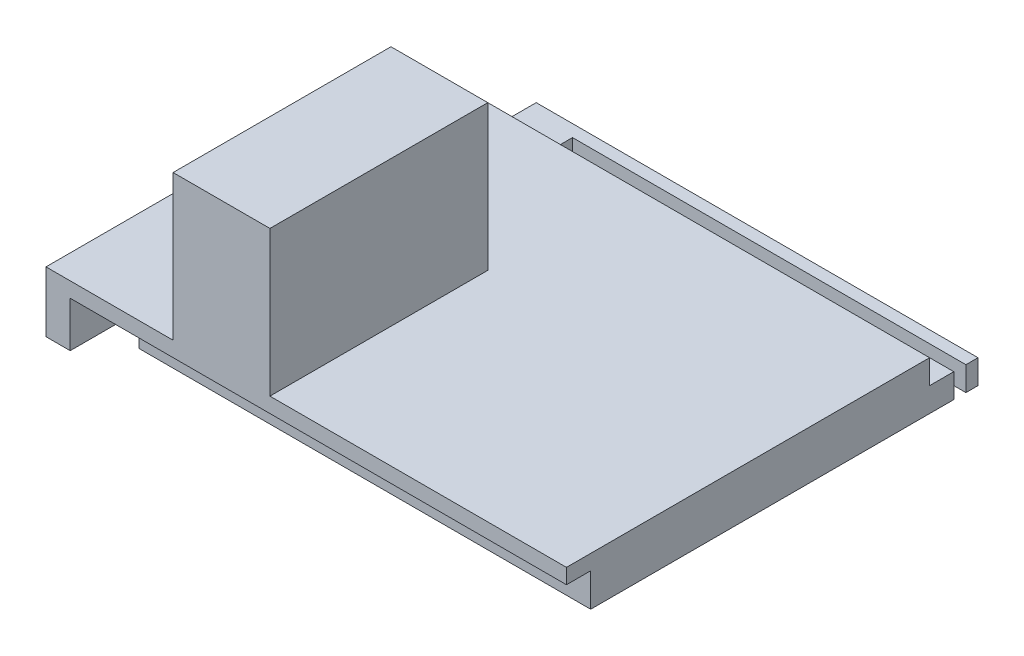
ISO-10303-21;
HEADER;
FILE_DESCRIPTION(('STEP AP214'),'2;1');
FILE_NAME('part.step','',(''),(''),'','','');
FILE_SCHEMA(('AUTOMOTIVE_DESIGN { 1 0 10303 214 1 1 1 1 }'));
ENDSEC;
DATA;
#1=APPLICATION_CONTEXT('core data for automotive mechanical design processes');
#2=APPLICATION_PROTOCOL_DEFINITION('international standard','automotive_design',2000,#1);
#3=PRODUCT_CONTEXT('',#1,'mechanical');
#4=PRODUCT('Part','Part','',(#3));
#5=PRODUCT_RELATED_PRODUCT_CATEGORY('part','',(#4));
#6=PRODUCT_DEFINITION_FORMATION('','',#4);
#7=PRODUCT_DEFINITION_CONTEXT('part definition',#1,'design');
#8=PRODUCT_DEFINITION('design','',#6,#7);
#9=PRODUCT_DEFINITION_SHAPE('','',#8);
#10=(LENGTH_UNIT() NAMED_UNIT(*) SI_UNIT(.MILLI.,.METRE.));
#11=(NAMED_UNIT(*) PLANE_ANGLE_UNIT() SI_UNIT($,.RADIAN.));
#12=(NAMED_UNIT(*) SI_UNIT($,.STERADIAN.) SOLID_ANGLE_UNIT());
#13=UNCERTAINTY_MEASURE_WITH_UNIT(LENGTH_MEASURE(1.E-05),#10,'distance_accuracy_value','');
#14=(GEOMETRIC_REPRESENTATION_CONTEXT(3) GLOBAL_UNCERTAINTY_ASSIGNED_CONTEXT((#13)) GLOBAL_UNIT_ASSIGNED_CONTEXT((#10,
#11,#12)) REPRESENTATION_CONTEXT('',''));
#15=CARTESIAN_POINT('',(0.,0.,0.));
#16=DIRECTION('',(0.,0.,1.));
#17=DIRECTION('',(1.,0.,0.));
#18=AXIS2_PLACEMENT_3D('',#15,#16,#17);
#19=CARTESIAN_POINT('',(0.,0.,18.));
#20=DIRECTION('',(0.,0.,1.));
#21=DIRECTION('',(1.,0.,0.));
#22=AXIS2_PLACEMENT_3D('',#19,#20,#21);
#23=PLANE('',#22);
#24=DIRECTION('',(1.,0.,0.));
#25=VECTOR('',#24,1.);
#26=CARTESIAN_POINT('',(-33.1377795178358,2.75505050617718,18.));
#27=LINE('',#26,#25);
#28=CARTESIAN_POINT('',(-31.,2.75505050617718,18.));
#29=VERTEX_POINT('',#28);
#30=CARTESIAN_POINT('',(10.,2.75505050617718,18.));
#31=VERTEX_POINT('',#30);
#32=EDGE_CURVE('E418',#29,#31,#27,.T.);
#33=ORIENTED_EDGE('',*,*,#32,.T.);
#34=DIRECTION('',(0.,-1.,0.));
#35=VECTOR('',#34,1.);
#36=CARTESIAN_POINT('',(10.,0.,18.));
#37=LINE('',#36,#35);
#38=CARTESIAN_POINT('',(10.,4.,18.));
#39=VERTEX_POINT('',#38);
#40=EDGE_CURVE('E396',#39,#31,#37,.T.);
#41=ORIENTED_EDGE('',*,*,#40,.F.);
#42=DIRECTION('',(-1.,0.,0.));
#43=VECTOR('',#42,1.);
#44=CARTESIAN_POINT('',(-24.5,4.,18.));
#45=LINE('',#44,#43);
#46=CARTESIAN_POINT('',(-14.5,4.,18.));
#47=VERTEX_POINT('',#46);
#48=EDGE_CURVE('E230',#39,#47,#45,.T.);
#49=ORIENTED_EDGE('',*,*,#48,.T.);
#50=DIRECTION('',(0.,-1.,0.));
#51=VECTOR('',#50,1.);
#52=CARTESIAN_POINT('',(-14.5,0.,18.));
#53=LINE('',#52,#51);
#54=CARTESIAN_POINT('',(-14.5,16.,18.));
#55=VERTEX_POINT('',#54);
#56=EDGE_CURVE('E221',#55,#47,#53,.T.);
#57=ORIENTED_EDGE('',*,*,#56,.F.);
#58=DIRECTION('',(1.,0.,0.));
#59=VECTOR('',#58,1.);
#60=CARTESIAN_POINT('',(0.,16.,18.));
#61=LINE('',#60,#59);
#62=CARTESIAN_POINT('',(-22.5,16.,18.));
#63=VERTEX_POINT('',#62);
#64=EDGE_CURVE('E219',#63,#55,#61,.T.);
#65=ORIENTED_EDGE('',*,*,#64,.F.);
#66=DIRECTION('',(0.,1.,0.));
#67=VECTOR('',#66,1.);
#68=CARTESIAN_POINT('',(-22.5,0.,18.));
#69=LINE('',#68,#67);
#70=CARTESIAN_POINT('',(-22.5,4.,18.));
#71=VERTEX_POINT('',#70);
#72=EDGE_CURVE('E203',#71,#63,#69,.T.);
#73=ORIENTED_EDGE('',*,*,#72,.F.);
#74=CARTESIAN_POINT('',(-33.,4.,18.));
#75=VERTEX_POINT('',#74);
#76=EDGE_CURVE('E215',#71,#75,#45,.T.);
#77=ORIENTED_EDGE('',*,*,#76,.T.);
#78=DIRECTION('',(0.,-1.,0.));
#79=VECTOR('',#78,1.);
#80=CARTESIAN_POINT('',(-33.,4.,18.));
#81=LINE('',#80,#79);
#82=CARTESIAN_POINT('',(-33.,-1.,18.));
#83=VERTEX_POINT('',#82);
#84=EDGE_CURVE('E237',#75,#83,#81,.T.);
#85=ORIENTED_EDGE('',*,*,#84,.T.);
#86=DIRECTION('',(1.,0.,0.));
#87=VECTOR('',#86,1.);
#88=CARTESIAN_POINT('',(-33.,-1.,18.));
#89=LINE('',#88,#87);
#90=CARTESIAN_POINT('',(-31.,-1.,18.));
#91=VERTEX_POINT('',#90);
#92=EDGE_CURVE('E246',#83,#91,#89,.T.);
#93=ORIENTED_EDGE('',*,*,#92,.T.);
#94=DIRECTION('',(0.,1.,0.));
#95=VECTOR('',#94,1.);
#96=CARTESIAN_POINT('',(-31.,-1.,18.));
#97=LINE('',#96,#95);
#98=EDGE_CURVE('E250',#91,#29,#97,.T.);
#99=ORIENTED_EDGE('',*,*,#98,.T.);
#100=EDGE_LOOP('',(#33,#41,#49,#57,#65,#73,#77,#85,#93,#99));
#101=FACE_BOUND('',#100,.T.);
#102=ADVANCED_FACE('F51',(#101),#23,.T.);
#103=CARTESIAN_POINT('',(0.,2.,0.));
#104=DIRECTION('',(0.,1.,0.));
#105=DIRECTION('',(0.,0.,1.));
#106=AXIS2_PLACEMENT_3D('',#103,#104,#105);
#107=PLANE('',#106);
#108=DIRECTION('',(1.,0.,0.));
#109=VECTOR('',#108,1.);
#110=CARTESIAN_POINT('',(-31.,2.,-12.));
#111=LINE('',#110,#109);
#112=CARTESIAN_POINT('',(-26.5,2.,-12.));
#113=VERTEX_POINT('',#112);
#114=CARTESIAN_POINT('',(10.,2.,-12.));
#115=VERTEX_POINT('',#114);
#116=EDGE_CURVE('E253',#113,#115,#111,.T.);
#117=ORIENTED_EDGE('',*,*,#116,.T.);
#118=DIRECTION('',(0.,0.,1.));
#119=VECTOR('',#118,1.);
#120=CARTESIAN_POINT('',(10.,2.,0.));
#121=LINE('',#120,#119);
#122=CARTESIAN_POINT('',(10.,2.,-14.));
#123=VERTEX_POINT('',#122);
#124=EDGE_CURVE('E407',#123,#115,#121,.T.);
#125=ORIENTED_EDGE('',*,*,#124,.F.);
#126=DIRECTION('',(1.,0.,0.));
#127=VECTOR('',#126,1.);
#128=CARTESIAN_POINT('',(0.,2.,-14.));
#129=LINE('',#128,#127);
#130=CARTESIAN_POINT('',(-22.5,2.,-14.));
#131=VERTEX_POINT('',#130);
#132=EDGE_CURVE('E295',#131,#123,#129,.T.);
#133=ORIENTED_EDGE('',*,*,#132,.F.);
#134=DIRECTION('',(0.,0.,1.));
#135=VECTOR('',#134,1.);
#136=CARTESIAN_POINT('',(-22.5,2.,0.));
#137=LINE('',#136,#135);
#138=CARTESIAN_POINT('',(-22.5,2.,-15.));
#139=VERTEX_POINT('',#138);
#140=EDGE_CURVE('E304',#139,#131,#137,.T.);
#141=ORIENTED_EDGE('',*,*,#140,.F.);
#142=DIRECTION('',(1.,0.,0.));
#143=VECTOR('',#142,1.);
#144=CARTESIAN_POINT('',(0.,2.,-15.));
#145=LINE('',#144,#143);
#146=CARTESIAN_POINT('',(10.,2.,-15.));
#147=VERTEX_POINT('',#146);
#148=EDGE_CURVE('E299',#139,#147,#145,.T.);
#149=ORIENTED_EDGE('',*,*,#148,.T.);
#150=CARTESIAN_POINT('',(10.,2.,-16.));
#151=VERTEX_POINT('',#150);
#152=EDGE_CURVE('E399',#151,#147,#121,.T.);
#153=ORIENTED_EDGE('',*,*,#152,.F.);
#154=DIRECTION('',(-1.,0.,0.));
#155=VECTOR('',#154,1.);
#156=CARTESIAN_POINT('',(0.,2.,-16.));
#157=LINE('',#156,#155);
#158=CARTESIAN_POINT('',(-26.5,2.,-16.));
#159=VERTEX_POINT('',#158);
#160=EDGE_CURVE('E344',#151,#159,#157,.T.);
#161=ORIENTED_EDGE('',*,*,#160,.T.);
#162=DIRECTION('',(0.,0.,1.));
#163=VECTOR('',#162,1.);
#164=CARTESIAN_POINT('',(-26.5,2.,0.));
#165=LINE('',#164,#163);
#166=EDGE_CURVE('E347',#159,#113,#165,.T.);
#167=ORIENTED_EDGE('',*,*,#166,.T.);
#168=EDGE_LOOP('',(#117,#125,#133,#141,#149,#153,#161,#167));
#169=FACE_BOUND('',#168,.T.);
#170=ADVANCED_FACE('F438',(#169),#107,.T.);
#171=CARTESIAN_POINT('',(0.,0.,0.));
#172=DIRECTION('',(0.,1.,0.));
#173=DIRECTION('',(0.,0.,1.));
#174=AXIS2_PLACEMENT_3D('',#171,#172,#173);
#175=PLANE('',#174);
#176=DIRECTION('',(0.,0.,1.));
#177=VECTOR('',#176,1.);
#178=CARTESIAN_POINT('',(10.,0.,0.));
#179=LINE('',#178,#177);
#180=CARTESIAN_POINT('',(10.,0.,-14.));
#181=VERTEX_POINT('',#180);
#182=CARTESIAN_POINT('',(10.,0.,16.));
#183=VERTEX_POINT('',#182);
#184=EDGE_CURVE('E382',#181,#183,#179,.T.);
#185=ORIENTED_EDGE('',*,*,#184,.T.);
#186=DIRECTION('',(-1.,0.,0.));
#187=VECTOR('',#186,1.);
#188=CARTESIAN_POINT('',(-26.5,0.,16.));
#189=LINE('',#188,#187);
#190=CARTESIAN_POINT('',(-27.3,0.,16.));
#191=VERTEX_POINT('',#190);
#192=EDGE_CURVE('E75',#183,#191,#189,.T.);
#193=ORIENTED_EDGE('',*,*,#192,.T.);
#194=DIRECTION('',(0.,0.,1.));
#195=VECTOR('',#194,1.);
#196=CARTESIAN_POINT('',(-27.3,0.,0.));
#197=LINE('',#196,#195);
#198=CARTESIAN_POINT('',(-27.3,0.,-16.));
#199=VERTEX_POINT('',#198);
#200=EDGE_CURVE('E324',#199,#191,#197,.T.);
#201=ORIENTED_EDGE('',*,*,#200,.F.);
#202=DIRECTION('',(-1.,0.,0.));
#203=VECTOR('',#202,1.);
#204=CARTESIAN_POINT('',(0.,0.,-16.));
#205=LINE('',#204,#203);
#206=CARTESIAN_POINT('',(10.,0.,-16.));
#207=VERTEX_POINT('',#206);
#208=EDGE_CURVE('E343',#207,#199,#205,.T.);
#209=ORIENTED_EDGE('',*,*,#208,.F.);
#210=CARTESIAN_POINT('',(10.,0.,-15.));
#211=VERTEX_POINT('',#210);
#212=EDGE_CURVE('E389',#207,#211,#179,.T.);
#213=ORIENTED_EDGE('',*,*,#212,.T.);
#214=DIRECTION('',(1.,0.,0.));
#215=VECTOR('',#214,1.);
#216=CARTESIAN_POINT('',(0.,0.,-15.));
#217=LINE('',#216,#215);
#218=CARTESIAN_POINT('',(-22.5,0.,-15.));
#219=VERTEX_POINT('',#218);
#220=EDGE_CURVE('E311',#219,#211,#217,.T.);
#221=ORIENTED_EDGE('',*,*,#220,.F.);
#222=DIRECTION('',(0.,0.,1.));
#223=VECTOR('',#222,1.);
#224=CARTESIAN_POINT('',(-22.5,0.,0.));
#225=LINE('',#224,#223);
#226=CARTESIAN_POINT('',(-22.5,0.,-14.));
#227=VERTEX_POINT('',#226);
#228=EDGE_CURVE('E300',#219,#227,#225,.T.);
#229=ORIENTED_EDGE('',*,*,#228,.T.);
#230=DIRECTION('',(1.,0.,0.));
#231=VECTOR('',#230,1.);
#232=CARTESIAN_POINT('',(0.,0.,-14.));
#233=LINE('',#232,#231);
#234=EDGE_CURVE('E294',#227,#181,#233,.T.);
#235=ORIENTED_EDGE('',*,*,#234,.T.);
#236=EDGE_LOOP('',(#185,#193,#201,#209,#213,#221,#229,#235));
#237=FACE_BOUND('',#236,.T.);
#238=ADVANCED_FACE('F380',(#237),#175,.F.);
#239=CARTESIAN_POINT('',(0.,2.,-16.));
#240=DIRECTION('',(0.,0.,1.));
#241=DIRECTION('',(1.,0.,0.));
#242=AXIS2_PLACEMENT_3D('',#239,#240,#241);
#243=PLANE('',#242);
#244=DIRECTION('',(0.,-1.,0.));
#245=VECTOR('',#244,1.);
#246=CARTESIAN_POINT('',(10.,0.,-16.));
#247=LINE('',#246,#245);
#248=EDGE_CURVE('E405',#151,#207,#247,.T.);
#249=ORIENTED_EDGE('',*,*,#248,.T.);
#250=ORIENTED_EDGE('',*,*,#208,.T.);
#251=DIRECTION('',(0.,-1.,0.));
#252=VECTOR('',#251,1.);
#253=CARTESIAN_POINT('',(-27.3,0.8,-16.));
#254=LINE('',#253,#252);
#255=CARTESIAN_POINT('',(-27.3,0.8,-16.));
#256=VERTEX_POINT('',#255);
#257=EDGE_CURVE('E336',#256,#199,#254,.T.);
#258=ORIENTED_EDGE('',*,*,#257,.F.);
#259=DIRECTION('',(-1.,0.,0.));
#260=VECTOR('',#259,1.);
#261=CARTESIAN_POINT('',(0.,0.8,-16.));
#262=LINE('',#261,#260);
#263=CARTESIAN_POINT('',(-26.5,0.8,-16.));
#264=VERTEX_POINT('',#263);
#265=EDGE_CURVE('E333',#264,#256,#262,.T.);
#266=ORIENTED_EDGE('',*,*,#265,.F.);
#267=DIRECTION('',(0.,-1.,0.));
#268=VECTOR('',#267,1.);
#269=CARTESIAN_POINT('',(-26.5,2.,-16.));
#270=LINE('',#269,#268);
#271=EDGE_CURVE('E60',#159,#264,#270,.T.);
#272=ORIENTED_EDGE('',*,*,#271,.F.);
#273=ORIENTED_EDGE('',*,*,#160,.F.);
#274=EDGE_LOOP('',(#249,#250,#258,#266,#272,#273));
#275=FACE_BOUND('',#274,.T.);
#276=ADVANCED_FACE('F53',(#275),#243,.F.);
#277=CARTESIAN_POINT('',(0.,2.,-14.));
#278=DIRECTION('',(0.,0.,-1.));
#279=DIRECTION('',(-1.,0.,0.));
#280=AXIS2_PLACEMENT_3D('',#277,#278,#279);
#281=PLANE('',#280);
#282=ORIENTED_EDGE('',*,*,#132,.T.);
#283=DIRECTION('',(0.,1.,0.));
#284=VECTOR('',#283,1.);
#285=CARTESIAN_POINT('',(10.,0.,-14.));
#286=LINE('',#285,#284);
#287=EDGE_CURVE('E394',#181,#123,#286,.T.);
#288=ORIENTED_EDGE('',*,*,#287,.F.);
#289=ORIENTED_EDGE('',*,*,#234,.F.);
#290=DIRECTION('',(0.,-1.,0.));
#291=VECTOR('',#290,1.);
#292=CARTESIAN_POINT('',(-22.5,2.,-14.));
#293=LINE('',#292,#291);
#294=EDGE_CURVE('E307',#131,#227,#293,.T.);
#295=ORIENTED_EDGE('',*,*,#294,.F.);
#296=EDGE_LOOP('',(#282,#288,#289,#295));
#297=FACE_BOUND('',#296,.T.);
#298=ADVANCED_FACE('F491',(#297),#281,.T.);
#299=CARTESIAN_POINT('',(0.,2.,-15.));
#300=DIRECTION('',(0.,0.,-1.));
#301=DIRECTION('',(-1.,0.,0.));
#302=AXIS2_PLACEMENT_3D('',#299,#300,#301);
#303=PLANE('',#302);
#304=DIRECTION('',(0.,1.,0.));
#305=VECTOR('',#304,1.);
#306=CARTESIAN_POINT('',(10.,0.,-15.));
#307=LINE('',#306,#305);
#308=EDGE_CURVE('E400',#211,#147,#307,.T.);
#309=ORIENTED_EDGE('',*,*,#308,.T.);
#310=ORIENTED_EDGE('',*,*,#148,.F.);
#311=DIRECTION('',(0.,-1.,0.));
#312=VECTOR('',#311,1.);
#313=CARTESIAN_POINT('',(-22.5,2.,-15.));
#314=LINE('',#313,#312);
#315=EDGE_CURVE('E321',#139,#219,#314,.T.);
#316=ORIENTED_EDGE('',*,*,#315,.T.);
#317=ORIENTED_EDGE('',*,*,#220,.T.);
#318=EDGE_LOOP('',(#309,#310,#316,#317));
#319=FACE_BOUND('',#318,.T.);
#320=ADVANCED_FACE('F480',(#319),#303,.F.);
#321=CARTESIAN_POINT('',(-24.5,4.,-12.));
#322=DIRECTION('',(0.,1.,0.));
#323=DIRECTION('',(-1.,0.,0.));
#324=AXIS2_PLACEMENT_3D('',#321,#322,#323);
#325=PLANE('',#324);
#326=DIRECTION('',(0.,0.,-1.));
#327=VECTOR('',#326,1.);
#328=CARTESIAN_POINT('',(-14.5,4.,18.));
#329=LINE('',#328,#327);
#330=CARTESIAN_POINT('',(-14.5,4.,0.));
#331=VERTEX_POINT('',#330);
#332=EDGE_CURVE('E210',#47,#331,#329,.T.);
#333=ORIENTED_EDGE('',*,*,#332,.F.);
#334=ORIENTED_EDGE('',*,*,#48,.F.);
#335=DIRECTION('',(0.,0.,1.));
#336=VECTOR('',#335,1.);
#337=CARTESIAN_POINT('',(10.,4.,0.));
#338=LINE('',#337,#336);
#339=CARTESIAN_POINT('',(10.,4.,-12.));
#340=VERTEX_POINT('',#339);
#341=EDGE_CURVE('E387',#340,#39,#338,.T.);
#342=ORIENTED_EDGE('',*,*,#341,.F.);
#343=DIRECTION('',(-1.,0.,0.));
#344=VECTOR('',#343,1.);
#345=CARTESIAN_POINT('',(-24.5,4.,-12.));
#346=LINE('',#345,#344);
#347=CARTESIAN_POINT('',(-33.,4.,-12.));
#348=VERTEX_POINT('',#347);
#349=EDGE_CURVE('E258',#340,#348,#346,.T.);
#350=ORIENTED_EDGE('',*,*,#349,.T.);
#351=DIRECTION('',(0.,0.,1.));
#352=VECTOR('',#351,1.);
#353=CARTESIAN_POINT('',(-33.,4.,-12.));
#354=LINE('',#353,#352);
#355=EDGE_CURVE('E227',#348,#75,#354,.T.);
#356=ORIENTED_EDGE('',*,*,#355,.T.);
#357=ORIENTED_EDGE('',*,*,#76,.F.);
#358=DIRECTION('',(0.,0.,-1.));
#359=VECTOR('',#358,1.);
#360=CARTESIAN_POINT('',(-22.5,4.,18.));
#361=LINE('',#360,#359);
#362=CARTESIAN_POINT('',(-22.5,4.,0.));
#363=VERTEX_POINT('',#362);
#364=EDGE_CURVE('E200',#71,#363,#361,.T.);
#365=ORIENTED_EDGE('',*,*,#364,.T.);
#366=DIRECTION('',(-1.,0.,0.));
#367=VECTOR('',#366,1.);
#368=CARTESIAN_POINT('',(0.,4.00000000000001,0.));
#369=LINE('',#368,#367);
#370=EDGE_CURVE('E67',#331,#363,#369,.T.);
#371=ORIENTED_EDGE('',*,*,#370,.F.);
#372=EDGE_LOOP('',(#333,#334,#342,#350,#356,#357,#365,#371));
#373=FACE_BOUND('',#372,.T.);
#374=ADVANCED_FACE('F225',(#373),#325,.T.);
#375=CARTESIAN_POINT('',(0.,0.,-12.));
#376=DIRECTION('',(0.,0.,1.));
#377=DIRECTION('',(1.,0.,0.));
#378=AXIS2_PLACEMENT_3D('',#375,#376,#377);
#379=PLANE('',#378);
#380=DIRECTION('',(0.,-1.,0.));
#381=VECTOR('',#380,1.);
#382=CARTESIAN_POINT('',(10.,0.,-12.));
#383=LINE('',#382,#381);
#384=EDGE_CURVE('E386',#340,#115,#383,.T.);
#385=ORIENTED_EDGE('',*,*,#384,.T.);
#386=ORIENTED_EDGE('',*,*,#116,.F.);
#387=CARTESIAN_POINT('',(-31.,2.,-12.));
#388=VERTEX_POINT('',#387);
#389=EDGE_CURVE('E254',#388,#113,#111,.T.);
#390=ORIENTED_EDGE('',*,*,#389,.F.);
#391=DIRECTION('',(0.,1.,0.));
#392=VECTOR('',#391,1.);
#393=CARTESIAN_POINT('',(-31.,-1.,-12.));
#394=LINE('',#393,#392);
#395=CARTESIAN_POINT('',(-31.,-1.,-12.));
#396=VERTEX_POINT('',#395);
#397=EDGE_CURVE('E269',#396,#388,#394,.T.);
#398=ORIENTED_EDGE('',*,*,#397,.F.);
#399=DIRECTION('',(1.,0.,0.));
#400=VECTOR('',#399,1.);
#401=CARTESIAN_POINT('',(-33.,-1.,-12.));
#402=LINE('',#401,#400);
#403=CARTESIAN_POINT('',(-33.,-1.,-12.));
#404=VERTEX_POINT('',#403);
#405=EDGE_CURVE('E265',#404,#396,#402,.T.);
#406=ORIENTED_EDGE('',*,*,#405,.F.);
#407=DIRECTION('',(0.,-1.,0.));
#408=VECTOR('',#407,1.);
#409=CARTESIAN_POINT('',(-33.,4.,-12.));
#410=LINE('',#409,#408);
#411=EDGE_CURVE('E261',#348,#404,#410,.T.);
#412=ORIENTED_EDGE('',*,*,#411,.F.);
#413=ORIENTED_EDGE('',*,*,#349,.F.);
#414=EDGE_LOOP('',(#385,#386,#390,#398,#406,#412,#413));
#415=FACE_BOUND('',#414,.T.);
#416=ADVANCED_FACE('F464',(#415),#379,.F.);
#417=CARTESIAN_POINT('',(-33.1377795178358,2.75505050617718,18.));
#418=DIRECTION('',(0.,1.,0.));
#419=DIRECTION('',(0.,0.,1.));
#420=AXIS2_PLACEMENT_3D('',#417,#418,#419);
#421=PLANE('',#420);
#422=DIRECTION('',(0.,0.,1.));
#423=VECTOR('',#422,1.);
#424=CARTESIAN_POINT('',(10.,2.75505050617718,0.));
#425=LINE('',#424,#423);
#426=CARTESIAN_POINT('',(10.,2.75505050617718,16.));
#427=VERTEX_POINT('',#426);
#428=EDGE_CURVE('E209',#427,#31,#425,.T.);
#429=ORIENTED_EDGE('',*,*,#428,.T.);
#430=ORIENTED_EDGE('',*,*,#32,.F.);
#431=DIRECTION('',(0.,0.,-1.));
#432=VECTOR('',#431,1.);
#433=CARTESIAN_POINT('',(-31.,2.75505050617718,18.));
#434=LINE('',#433,#432);
#435=CARTESIAN_POINT('',(-31.,2.75505050617718,16.));
#436=VERTEX_POINT('',#435);
#437=EDGE_CURVE('E231',#29,#436,#434,.T.);
#438=ORIENTED_EDGE('',*,*,#437,.T.);
#439=DIRECTION('',(1.,0.,0.));
#440=VECTOR('',#439,1.);
#441=CARTESIAN_POINT('',(-33.1377795178358,2.75505050617718,16.));
#442=LINE('',#441,#440);
#443=EDGE_CURVE('E421',#436,#427,#442,.T.);
#444=ORIENTED_EDGE('',*,*,#443,.T.);
#445=EDGE_LOOP('',(#429,#430,#438,#444));
#446=FACE_BOUND('',#445,.T.);
#447=ADVANCED_FACE('F463',(#446),#421,.F.);
#448=CARTESIAN_POINT('',(-31.,2.,-12.));
#449=DIRECTION('',(0.,-1.,0.));
#450=DIRECTION('',(0.,0.,-1.));
#451=AXIS2_PLACEMENT_3D('',#448,#449,#450);
#452=PLANE('',#451);
#453=DIRECTION('',(1.,0.,0.));
#454=VECTOR('',#453,1.);
#455=CARTESIAN_POINT('',(-33.1377795178358,2.,16.));
#456=LINE('',#455,#454);
#457=CARTESIAN_POINT('',(-31.,2.,16.));
#458=VERTEX_POINT('',#457);
#459=CARTESIAN_POINT('',(-26.5,2.,16.));
#460=VERTEX_POINT('',#459);
#461=EDGE_CURVE('E242',#458,#460,#456,.T.);
#462=ORIENTED_EDGE('',*,*,#461,.F.);
#463=DIRECTION('',(0.,0.,1.));
#464=VECTOR('',#463,1.);
#465=CARTESIAN_POINT('',(-31.,2.,-12.));
#466=LINE('',#465,#464);
#467=EDGE_CURVE('E273',#388,#458,#466,.T.);
#468=ORIENTED_EDGE('',*,*,#467,.F.);
#469=ORIENTED_EDGE('',*,*,#389,.T.);
#470=DIRECTION('',(0.,0.,-1.));
#471=VECTOR('',#470,1.);
#472=CARTESIAN_POINT('',(-26.5,2.,0.));
#473=LINE('',#472,#471);
#474=EDGE_CURVE('E277',#460,#113,#473,.T.);
#475=ORIENTED_EDGE('',*,*,#474,.F.);
#476=EDGE_LOOP('',(#462,#468,#469,#475));
#477=FACE_BOUND('',#476,.T.);
#478=ADVANCED_FACE('F434',(#477),#452,.T.);
#479=CARTESIAN_POINT('',(-27.3,0.8,0.));
#480=DIRECTION('',(1.,0.,0.));
#481=DIRECTION('',(0.,0.,-1.));
#482=AXIS2_PLACEMENT_3D('',#479,#480,#481);
#483=PLANE('',#482);
#484=DIRECTION('',(0.,-1.,0.));
#485=VECTOR('',#484,1.);
#486=CARTESIAN_POINT('',(-27.3,10.,16.));
#487=LINE('',#486,#485);
#488=CARTESIAN_POINT('',(-27.3,0.8,16.));
#489=VERTEX_POINT('',#488);
#490=EDGE_CURVE('E291',#489,#191,#487,.T.);
#491=ORIENTED_EDGE('',*,*,#490,.F.);
#492=DIRECTION('',(0.,0.,1.));
#493=VECTOR('',#492,1.);
#494=CARTESIAN_POINT('',(-27.3,0.8,0.));
#495=LINE('',#494,#493);
#496=EDGE_CURVE('E325',#256,#489,#495,.T.);
#497=ORIENTED_EDGE('',*,*,#496,.F.);
#498=ORIENTED_EDGE('',*,*,#257,.T.);
#499=ORIENTED_EDGE('',*,*,#200,.T.);
#500=EDGE_LOOP('',(#491,#497,#498,#499));
#501=FACE_BOUND('',#500,.T.);
#502=ADVANCED_FACE('F375',(#501),#483,.F.);
#503=CARTESIAN_POINT('',(0.,0.8,0.));
#504=DIRECTION('',(0.,1.,0.));
#505=DIRECTION('',(0.,0.,1.));
#506=AXIS2_PLACEMENT_3D('',#503,#504,#505);
#507=PLANE('',#506);
#508=ORIENTED_EDGE('',*,*,#496,.T.);
#509=DIRECTION('',(1.,0.,0.));
#510=VECTOR('',#509,1.);
#511=CARTESIAN_POINT('',(0.,0.8,16.));
#512=LINE('',#511,#510);
#513=CARTESIAN_POINT('',(-26.5,0.8,16.));
#514=VERTEX_POINT('',#513);
#515=EDGE_CURVE('E11',#489,#514,#512,.T.);
#516=ORIENTED_EDGE('',*,*,#515,.T.);
#517=DIRECTION('',(0.,0.,1.));
#518=VECTOR('',#517,1.);
#519=CARTESIAN_POINT('',(-26.5,0.8,0.));
#520=LINE('',#519,#518);
#521=EDGE_CURVE('E329',#264,#514,#520,.T.);
#522=ORIENTED_EDGE('',*,*,#521,.F.);
#523=ORIENTED_EDGE('',*,*,#265,.T.);
#524=EDGE_LOOP('',(#508,#516,#522,#523));
#525=FACE_BOUND('',#524,.T.);
#526=ADVANCED_FACE('F371',(#525),#507,.T.);
#527=CARTESIAN_POINT('',(-26.5,2.,0.));
#528=DIRECTION('',(1.,0.,0.));
#529=DIRECTION('',(0.,0.,-1.));
#530=AXIS2_PLACEMENT_3D('',#527,#528,#529);
#531=PLANE('',#530);
#532=ORIENTED_EDGE('',*,*,#271,.T.);
#533=ORIENTED_EDGE('',*,*,#521,.T.);
#534=DIRECTION('',(0.,-1.,0.));
#535=VECTOR('',#534,1.);
#536=CARTESIAN_POINT('',(-26.5,2.,16.));
#537=LINE('',#536,#535);
#538=EDGE_CURVE('E351',#460,#514,#537,.T.);
#539=ORIENTED_EDGE('',*,*,#538,.F.);
#540=ORIENTED_EDGE('',*,*,#474,.T.);
#541=ORIENTED_EDGE('',*,*,#166,.F.);
#542=EDGE_LOOP('',(#532,#533,#539,#540,#541));
#543=FACE_BOUND('',#542,.T.);
#544=ADVANCED_FACE('F362',(#543),#531,.F.);
#545=CARTESIAN_POINT('',(-22.5,2.,0.));
#546=DIRECTION('',(1.,0.,0.));
#547=DIRECTION('',(0.,0.,-1.));
#548=AXIS2_PLACEMENT_3D('',#545,#546,#547);
#549=PLANE('',#548);
#550=ORIENTED_EDGE('',*,*,#228,.F.);
#551=ORIENTED_EDGE('',*,*,#315,.F.);
#552=ORIENTED_EDGE('',*,*,#140,.T.);
#553=ORIENTED_EDGE('',*,*,#294,.T.);
#554=EDGE_LOOP('',(#550,#551,#552,#553));
#555=FACE_BOUND('',#554,.T.);
#556=ADVANCED_FACE('F485',(#555),#549,.T.);
#557=CARTESIAN_POINT('',(-26.5,10.,16.));
#558=DIRECTION('',(0.,0.,1.));
#559=DIRECTION('',(1.,0.,0.));
#560=AXIS2_PLACEMENT_3D('',#557,#558,#559);
#561=PLANE('',#560);
#562=ORIENTED_EDGE('',*,*,#490,.T.);
#563=ORIENTED_EDGE('',*,*,#192,.F.);
#564=DIRECTION('',(0.,-1.,0.));
#565=VECTOR('',#564,1.);
#566=CARTESIAN_POINT('',(10.,0.,16.));
#567=LINE('',#566,#565);
#568=EDGE_CURVE('E667',#427,#183,#567,.T.);
#569=ORIENTED_EDGE('',*,*,#568,.F.);
#570=ORIENTED_EDGE('',*,*,#443,.F.);
#571=DIRECTION('',(0.,-1.,0.));
#572=VECTOR('',#571,1.);
#573=CARTESIAN_POINT('',(-31.,2.75505050617718,16.));
#574=LINE('',#573,#572);
#575=EDGE_CURVE('E238',#436,#458,#574,.T.);
#576=ORIENTED_EDGE('',*,*,#575,.T.);
#577=ORIENTED_EDGE('',*,*,#461,.T.);
#578=ORIENTED_EDGE('',*,*,#538,.T.);
#579=ORIENTED_EDGE('',*,*,#515,.F.);
#580=EDGE_LOOP('',(#562,#563,#569,#570,#576,#577,#578,#579));
#581=FACE_BOUND('',#580,.T.);
#582=ADVANCED_FACE('F373',(#581),#561,.T.);
#583=CARTESIAN_POINT('',(-31.,-1.,-12.));
#584=DIRECTION('',(1.,0.,0.));
#585=DIRECTION('',(0.,0.,-1.));
#586=AXIS2_PLACEMENT_3D('',#583,#584,#585);
#587=PLANE('',#586);
#588=ORIENTED_EDGE('',*,*,#467,.T.);
#589=ORIENTED_EDGE('',*,*,#575,.F.);
#590=ORIENTED_EDGE('',*,*,#437,.F.);
#591=ORIENTED_EDGE('',*,*,#98,.F.);
#592=DIRECTION('',(0.,0.,1.));
#593=VECTOR('',#592,1.);
#594=CARTESIAN_POINT('',(-31.,-1.,-12.));
#595=LINE('',#594,#593);
#596=EDGE_CURVE('E278',#396,#91,#595,.T.);
#597=ORIENTED_EDGE('',*,*,#596,.F.);
#598=ORIENTED_EDGE('',*,*,#397,.T.);
#599=EDGE_LOOP('',(#588,#589,#590,#591,#597,#598));
#600=FACE_BOUND('',#599,.T.);
#601=ADVANCED_FACE('F468',(#600),#587,.T.);
#602=CARTESIAN_POINT('',(-33.,-1.,-12.));
#603=DIRECTION('',(0.,-1.,0.));
#604=DIRECTION('',(0.,0.,-1.));
#605=AXIS2_PLACEMENT_3D('',#602,#603,#604);
#606=PLANE('',#605);
#607=ORIENTED_EDGE('',*,*,#596,.T.);
#608=ORIENTED_EDGE('',*,*,#92,.F.);
#609=DIRECTION('',(0.,0.,1.));
#610=VECTOR('',#609,1.);
#611=CARTESIAN_POINT('',(-33.,-1.,-12.));
#612=LINE('',#611,#610);
#613=EDGE_CURVE('E281',#404,#83,#612,.T.);
#614=ORIENTED_EDGE('',*,*,#613,.F.);
#615=ORIENTED_EDGE('',*,*,#405,.T.);
#616=EDGE_LOOP('',(#607,#608,#614,#615));
#617=FACE_BOUND('',#616,.T.);
#618=ADVANCED_FACE('F471',(#617),#606,.T.);
#619=CARTESIAN_POINT('',(-33.,4.,-12.));
#620=DIRECTION('',(-1.,0.,0.));
#621=DIRECTION('',(0.,0.,1.));
#622=AXIS2_PLACEMENT_3D('',#619,#620,#621);
#623=PLANE('',#622);
#624=ORIENTED_EDGE('',*,*,#613,.T.);
#625=ORIENTED_EDGE('',*,*,#84,.F.);
#626=ORIENTED_EDGE('',*,*,#355,.F.);
#627=ORIENTED_EDGE('',*,*,#411,.T.);
#628=EDGE_LOOP('',(#624,#625,#626,#627));
#629=FACE_BOUND('',#628,.T.);
#630=ADVANCED_FACE('F453',(#629),#623,.T.);
#631=CARTESIAN_POINT('',(10.,0.,0.));
#632=DIRECTION('',(1.,0.,0.));
#633=DIRECTION('',(0.,0.,-1.));
#634=AXIS2_PLACEMENT_3D('',#631,#632,#633);
#635=PLANE('',#634);
#636=ORIENTED_EDGE('',*,*,#568,.T.);
#637=ORIENTED_EDGE('',*,*,#184,.F.);
#638=ORIENTED_EDGE('',*,*,#287,.T.);
#639=ORIENTED_EDGE('',*,*,#124,.T.);
#640=ORIENTED_EDGE('',*,*,#384,.F.);
#641=ORIENTED_EDGE('',*,*,#341,.T.);
#642=ORIENTED_EDGE('',*,*,#40,.T.);
#643=ORIENTED_EDGE('',*,*,#428,.F.);
#644=EDGE_LOOP('',(#636,#637,#638,#639,#640,#641,#642,#643));
#645=FACE_BOUND('',#644,.T.);
#646=ADVANCED_FACE('F445',(#645),#635,.T.);
#647=ORIENTED_EDGE('',*,*,#152,.T.);
#648=ORIENTED_EDGE('',*,*,#308,.F.);
#649=ORIENTED_EDGE('',*,*,#212,.F.);
#650=ORIENTED_EDGE('',*,*,#248,.F.);
#651=EDGE_LOOP('',(#647,#648,#649,#650));
#652=FACE_BOUND('',#651,.T.);
#653=ADVANCED_FACE('F443',(#652),#635,.T.);
#654=CARTESIAN_POINT('',(-22.5,0.,18.));
#655=DIRECTION('',(-1.,0.,0.));
#656=DIRECTION('',(0.,0.,1.));
#657=AXIS2_PLACEMENT_3D('',#654,#655,#656);
#658=PLANE('',#657);
#659=DIRECTION('',(0.,1.,0.));
#660=VECTOR('',#659,1.);
#661=CARTESIAN_POINT('',(-22.5,0.,0.));
#662=LINE('',#661,#660);
#663=CARTESIAN_POINT('',(-22.5,16.,0.));
#664=VERTEX_POINT('',#663);
#665=EDGE_CURVE('E205',#363,#664,#662,.T.);
#666=ORIENTED_EDGE('',*,*,#665,.F.);
#667=ORIENTED_EDGE('',*,*,#364,.F.);
#668=ORIENTED_EDGE('',*,*,#72,.T.);
#669=DIRECTION('',(0.,0.,-1.));
#670=VECTOR('',#669,1.);
#671=CARTESIAN_POINT('',(-22.5,16.,18.));
#672=LINE('',#671,#670);
#673=EDGE_CURVE('E649',#63,#664,#672,.T.);
#674=ORIENTED_EDGE('',*,*,#673,.T.);
#675=EDGE_LOOP('',(#666,#667,#668,#674));
#676=FACE_BOUND('',#675,.T.);
#677=ADVANCED_FACE('F202',(#676),#658,.T.);
#678=CARTESIAN_POINT('',(-14.5,0.,18.));
#679=DIRECTION('',(1.,0.,0.));
#680=DIRECTION('',(0.,1.,0.));
#681=AXIS2_PLACEMENT_3D('',#678,#679,#680);
#682=PLANE('',#681);
#683=DIRECTION('',(0.,-1.,0.));
#684=VECTOR('',#683,1.);
#685=CARTESIAN_POINT('',(-14.5,0.,0.));
#686=LINE('',#685,#684);
#687=CARTESIAN_POINT('',(-14.5,16.,0.));
#688=VERTEX_POINT('',#687);
#689=EDGE_CURVE('E653',#688,#331,#686,.T.);
#690=ORIENTED_EDGE('',*,*,#689,.F.);
#691=DIRECTION('',(0.,0.,-1.));
#692=VECTOR('',#691,1.);
#693=CARTESIAN_POINT('',(-14.5,16.,18.));
#694=LINE('',#693,#692);
#695=EDGE_CURVE('E650',#55,#688,#694,.T.);
#696=ORIENTED_EDGE('',*,*,#695,.F.);
#697=ORIENTED_EDGE('',*,*,#56,.T.);
#698=ORIENTED_EDGE('',*,*,#332,.T.);
#699=EDGE_LOOP('',(#690,#696,#697,#698));
#700=FACE_BOUND('',#699,.T.);
#701=ADVANCED_FACE('F450',(#700),#682,.T.);
#702=CARTESIAN_POINT('',(0.,16.,18.));
#703=DIRECTION('',(0.,1.,0.));
#704=DIRECTION('',(0.,0.,1.));
#705=AXIS2_PLACEMENT_3D('',#702,#703,#704);
#706=PLANE('',#705);
#707=DIRECTION('',(1.,0.,0.));
#708=VECTOR('',#707,1.);
#709=CARTESIAN_POINT('',(0.,16.,0.));
#710=LINE('',#709,#708);
#711=EDGE_CURVE('E222',#664,#688,#710,.T.);
#712=ORIENTED_EDGE('',*,*,#711,.F.);
#713=ORIENTED_EDGE('',*,*,#673,.F.);
#714=ORIENTED_EDGE('',*,*,#64,.T.);
#715=ORIENTED_EDGE('',*,*,#695,.T.);
#716=EDGE_LOOP('',(#712,#713,#714,#715));
#717=FACE_BOUND('',#716,.T.);
#718=ADVANCED_FACE('F623',(#717),#706,.T.);
#719=CARTESIAN_POINT('',(0.,0.,0.));
#720=DIRECTION('',(0.,0.,1.));
#721=DIRECTION('',(1.,0.,0.));
#722=AXIS2_PLACEMENT_3D('',#719,#720,#721);
#723=PLANE('',#722);
#724=ORIENTED_EDGE('',*,*,#665,.T.);
#725=ORIENTED_EDGE('',*,*,#711,.T.);
#726=ORIENTED_EDGE('',*,*,#689,.T.);
#727=ORIENTED_EDGE('',*,*,#370,.T.);
#728=EDGE_LOOP('',(#724,#725,#726,#727));
#729=FACE_BOUND('',#728,.T.);
#730=ADVANCED_FACE('F633',(#729),#723,.F.);
#731=CLOSED_SHELL('',(#102,#170,#238,#276,#298,#320,#374,#416,#447,#478,#502,#526,#544,#556,
#582,#601,#618,#630,#646,#653,#677,#701,#718,#730));
#732=MANIFOLD_SOLID_BREP('B2',#731);
#733=ADVANCED_BREP_SHAPE_REPRESENTATION('',(#18,#732),#14);
#734=SHAPE_DEFINITION_REPRESENTATION(#9,#733);
ENDSEC;
END-ISO-10303-21;
